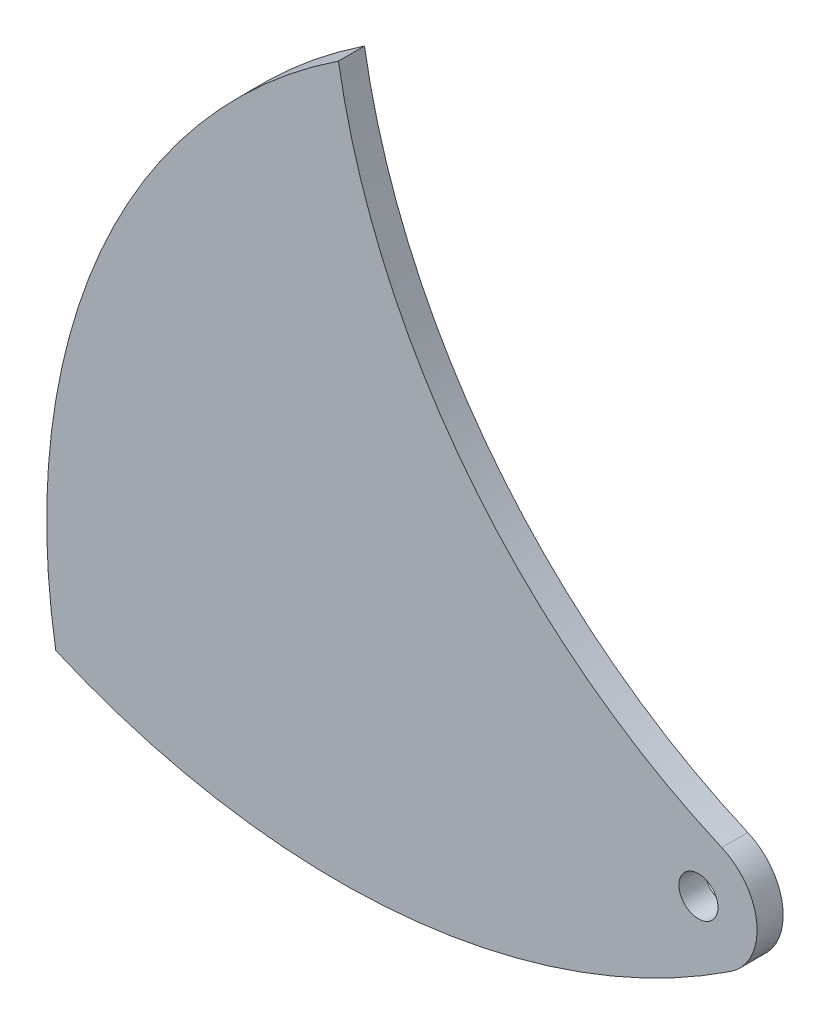
ISO-10303-21;
HEADER;
FILE_DESCRIPTION(('STEP AP214'),'2;1');
FILE_NAME('part.step','',(''),(''),'','','');
FILE_SCHEMA(('AUTOMOTIVE_DESIGN { 1 0 10303 214 1 1 1 1 }'));
ENDSEC;
DATA;
#1=APPLICATION_CONTEXT('core data for automotive mechanical design processes');
#2=APPLICATION_PROTOCOL_DEFINITION('international standard','automotive_design',2000,#1);
#3=PRODUCT_CONTEXT('',#1,'mechanical');
#4=PRODUCT('Part','Part','',(#3));
#5=PRODUCT_RELATED_PRODUCT_CATEGORY('part','',(#4));
#6=PRODUCT_DEFINITION_FORMATION('','',#4);
#7=PRODUCT_DEFINITION_CONTEXT('part definition',#1,'design');
#8=PRODUCT_DEFINITION('design','',#6,#7);
#9=PRODUCT_DEFINITION_SHAPE('','',#8);
#10=(LENGTH_UNIT() NAMED_UNIT(*) SI_UNIT(.MILLI.,.METRE.));
#11=(NAMED_UNIT(*) PLANE_ANGLE_UNIT() SI_UNIT($,.RADIAN.));
#12=(NAMED_UNIT(*) SI_UNIT($,.STERADIAN.) SOLID_ANGLE_UNIT());
#13=UNCERTAINTY_MEASURE_WITH_UNIT(LENGTH_MEASURE(1.E-05),#10,'distance_accuracy_value','');
#14=(GEOMETRIC_REPRESENTATION_CONTEXT(3) GLOBAL_UNCERTAINTY_ASSIGNED_CONTEXT((#13)) GLOBAL_UNIT_ASSIGNED_CONTEXT((#10,
#11,#12)) REPRESENTATION_CONTEXT('',''));
#15=CARTESIAN_POINT('',(0.,0.,0.));
#16=DIRECTION('',(0.,0.,1.));
#17=DIRECTION('',(1.,0.,0.));
#18=AXIS2_PLACEMENT_3D('',#15,#16,#17);
#19=CARTESIAN_POINT('',(5.42131211055036,12.5,1.));
#20=DIRECTION('',(0.,0.,1.));
#21=DIRECTION('',(1.,0.,0.));
#22=AXIS2_PLACEMENT_3D('',#19,#20,#21);
#23=PLANE('',#22);
#24=CARTESIAN_POINT('',(10.8426242211007,25.,1.));
#25=DIRECTION('',(0.,0.,-1.));
#26=DIRECTION('',(1.,0.,0.));
#27=AXIS2_PLACEMENT_3D('',#24,#25,#26);
#28=CIRCLE('',#27,25.);
#29=CARTESIAN_POINT('',(0.895262550366114,2.06422018348624,1.));
#30=VERTEX_POINT('',#29);
#31=CARTESIAN_POINT('',(-13.8088723865261,20.8402265681695,1.));
#32=VERTEX_POINT('',#31);
#33=EDGE_CURVE('E85',#30,#32,#28,.T.);
#34=ORIENTED_EDGE('',*,*,#33,.T.);
#35=CARTESIAN_POINT('',(0.,0.,1.));
#36=DIRECTION('',(0.,0.,1.));
#37=DIRECTION('',(1.,0.,0.));
#38=AXIS2_PLACEMENT_3D('',#35,#36,#37);
#39=CIRCLE('',#38,25.);
#40=CARTESIAN_POINT('',(-24.6514966076268,-4.15977343183052,1.));
#41=VERTEX_POINT('',#40);
#42=EDGE_CURVE('E80',#32,#41,#39,.T.);
#43=ORIENTED_EDGE('',*,*,#42,.T.);
#44=CARTESIAN_POINT('',(-13.8088723865261,20.8402265681695,1.));
#45=DIRECTION('',(0.,0.,1.));
#46=DIRECTION('',(1.,0.,0.));
#47=AXIS2_PLACEMENT_3D('',#44,#45,#46);
#48=CIRCLE('',#47,27.25);
#49=CARTESIAN_POINT('',(1.24279851478735,-1.87562039113525,1.));
#50=VERTEX_POINT('',#49);
#51=EDGE_CURVE('E83',#41,#50,#48,.T.);
#52=ORIENTED_EDGE('',*,*,#51,.T.);
#53=CARTESIAN_POINT('',(0.,0.,1.));
#54=DIRECTION('',(0.,0.,1.));
#55=DIRECTION('',(1.,0.,0.));
#56=AXIS2_PLACEMENT_3D('',#53,#54,#55);
#57=CIRCLE('',#56,2.25);
#58=EDGE_CURVE('E50',#50,#30,#57,.T.);
#59=ORIENTED_EDGE('',*,*,#58,.T.);
#60=EDGE_LOOP('',(#34,#43,#52,#59));
#61=FACE_BOUND('',#60,.T.);
#62=CARTESIAN_POINT('',(0.,0.,1.));
#63=DIRECTION('',(0.,0.,1.));
#64=DIRECTION('',(1.,0.,0.));
#65=AXIS2_PLACEMENT_3D('',#62,#63,#64);
#66=CIRCLE('',#65,0.75);
#67=CARTESIAN_POINT('',(0.75,0.,1.));
#68=VERTEX_POINT('',#67);
#69=EDGE_CURVE('E100',#68,#68,#66,.T.);
#70=ORIENTED_EDGE('',*,*,#69,.F.);
#71=EDGE_LOOP('',(#70));
#72=FACE_BOUND('',#71,.T.);
#73=ADVANCED_FACE('F33',(#61,#72),#23,.T.);
#74=CARTESIAN_POINT('',(5.42131211055036,12.5,0.));
#75=DIRECTION('',(0.,0.,1.));
#76=DIRECTION('',(1.,0.,0.));
#77=AXIS2_PLACEMENT_3D('',#74,#75,#76);
#78=PLANE('',#77);
#79=CARTESIAN_POINT('',(10.8426242211007,25.,0.));
#80=DIRECTION('',(0.,0.,-1.));
#81=DIRECTION('',(1.,0.,0.));
#82=AXIS2_PLACEMENT_3D('',#79,#80,#81);
#83=CIRCLE('',#82,25.);
#84=CARTESIAN_POINT('',(0.895262550366114,2.06422018348624,0.));
#85=VERTEX_POINT('',#84);
#86=CARTESIAN_POINT('',(-13.8088723865261,20.8402265681695,0.));
#87=VERTEX_POINT('',#86);
#88=EDGE_CURVE('E97',#85,#87,#83,.T.);
#89=ORIENTED_EDGE('',*,*,#88,.F.);
#90=CARTESIAN_POINT('',(0.,0.,0.));
#91=DIRECTION('',(0.,0.,1.));
#92=DIRECTION('',(1.,0.,0.));
#93=AXIS2_PLACEMENT_3D('',#90,#91,#92);
#94=CIRCLE('',#93,2.25);
#95=CARTESIAN_POINT('',(1.24279851478735,-1.87562039113525,0.));
#96=VERTEX_POINT('',#95);
#97=EDGE_CURVE('E73',#96,#85,#94,.T.);
#98=ORIENTED_EDGE('',*,*,#97,.F.);
#99=CARTESIAN_POINT('',(-13.8088723865261,20.8402265681695,0.));
#100=DIRECTION('',(0.,0.,1.));
#101=DIRECTION('',(1.,0.,0.));
#102=AXIS2_PLACEMENT_3D('',#99,#100,#101);
#103=CIRCLE('',#102,27.25);
#104=CARTESIAN_POINT('',(-24.6514966076268,-4.15977343183052,0.));
#105=VERTEX_POINT('',#104);
#106=EDGE_CURVE('E67',#105,#96,#103,.T.);
#107=ORIENTED_EDGE('',*,*,#106,.F.);
#108=CARTESIAN_POINT('',(0.,0.,0.));
#109=DIRECTION('',(0.,0.,1.));
#110=DIRECTION('',(1.,0.,0.));
#111=AXIS2_PLACEMENT_3D('',#108,#109,#110);
#112=CIRCLE('',#111,25.);
#113=EDGE_CURVE('E89',#87,#105,#112,.T.);
#114=ORIENTED_EDGE('',*,*,#113,.F.);
#115=EDGE_LOOP('',(#89,#98,#107,#114));
#116=FACE_BOUND('',#115,.T.);
#117=CARTESIAN_POINT('',(0.,0.,0.));
#118=DIRECTION('',(0.,0.,1.));
#119=DIRECTION('',(1.,0.,0.));
#120=AXIS2_PLACEMENT_3D('',#117,#118,#119);
#121=CIRCLE('',#120,0.75);
#122=CARTESIAN_POINT('',(0.75,0.,0.));
#123=VERTEX_POINT('',#122);
#124=EDGE_CURVE('E112',#123,#123,#121,.T.);
#125=ORIENTED_EDGE('',*,*,#124,.T.);
#126=EDGE_LOOP('',(#125));
#127=FACE_BOUND('',#126,.T.);
#128=ADVANCED_FACE('F108',(#116,#127),#78,.F.);
#129=CARTESIAN_POINT('',(10.8426242211007,25.,1.));
#130=DIRECTION('',(0.,0.,-1.));
#131=DIRECTION('',(-1.,0.,0.));
#132=AXIS2_PLACEMENT_3D('',#129,#130,#131);
#133=CYLINDRICAL_SURFACE('',#132,25.);
#134=ORIENTED_EDGE('',*,*,#88,.T.);
#135=DIRECTION('',(0.,0.,-1.));
#136=VECTOR('',#135,1.);
#137=CARTESIAN_POINT('',(-13.8088723865261,20.8402265681695,1.));
#138=LINE('',#137,#136);
#139=EDGE_CURVE('E11',#32,#87,#138,.T.);
#140=ORIENTED_EDGE('',*,*,#139,.F.);
#141=ORIENTED_EDGE('',*,*,#33,.F.);
#142=DIRECTION('',(0.,0.,-1.));
#143=VECTOR('',#142,1.);
#144=CARTESIAN_POINT('',(0.895262550366114,2.06422018348624,1.));
#145=LINE('',#144,#143);
#146=EDGE_CURVE('E93',#30,#85,#145,.T.);
#147=ORIENTED_EDGE('',*,*,#146,.T.);
#148=EDGE_LOOP('',(#134,#140,#141,#147));
#149=FACE_BOUND('',#148,.T.);
#150=ADVANCED_FACE('F35',(#149),#133,.F.);
#151=CARTESIAN_POINT('',(0.,0.,1.));
#152=DIRECTION('',(0.,0.,-1.));
#153=DIRECTION('',(-1.,0.,0.));
#154=AXIS2_PLACEMENT_3D('',#151,#152,#153);
#155=CYLINDRICAL_SURFACE('',#154,25.);
#156=ORIENTED_EDGE('',*,*,#113,.T.);
#157=DIRECTION('',(0.,0.,-1.));
#158=VECTOR('',#157,1.);
#159=CARTESIAN_POINT('',(-24.6514966076268,-4.15977343183052,1.));
#160=LINE('',#159,#158);
#161=EDGE_CURVE('E42',#41,#105,#160,.T.);
#162=ORIENTED_EDGE('',*,*,#161,.F.);
#163=ORIENTED_EDGE('',*,*,#42,.F.);
#164=ORIENTED_EDGE('',*,*,#139,.T.);
#165=EDGE_LOOP('',(#156,#162,#163,#164));
#166=FACE_BOUND('',#165,.T.);
#167=ADVANCED_FACE('F88',(#166),#155,.T.);
#168=CARTESIAN_POINT('',(-13.8088723865261,20.8402265681695,1.));
#169=DIRECTION('',(0.,0.,-1.));
#170=DIRECTION('',(-1.,0.,0.));
#171=AXIS2_PLACEMENT_3D('',#168,#169,#170);
#172=CYLINDRICAL_SURFACE('',#171,27.25);
#173=ORIENTED_EDGE('',*,*,#106,.T.);
#174=DIRECTION('',(0.,0.,-1.));
#175=VECTOR('',#174,1.);
#176=CARTESIAN_POINT('',(1.24279851478735,-1.87562039113525,1.));
#177=LINE('',#176,#175);
#178=EDGE_CURVE('E90',#50,#96,#177,.T.);
#179=ORIENTED_EDGE('',*,*,#178,.F.);
#180=ORIENTED_EDGE('',*,*,#51,.F.);
#181=ORIENTED_EDGE('',*,*,#161,.T.);
#182=EDGE_LOOP('',(#173,#179,#180,#181));
#183=FACE_BOUND('',#182,.T.);
#184=ADVANCED_FACE('F91',(#183),#172,.T.);
#185=CARTESIAN_POINT('',(0.,0.,1.));
#186=DIRECTION('',(0.,0.,-1.));
#187=DIRECTION('',(-1.,0.,0.));
#188=AXIS2_PLACEMENT_3D('',#185,#186,#187);
#189=CYLINDRICAL_SURFACE('',#188,2.25);
#190=ORIENTED_EDGE('',*,*,#97,.T.);
#191=ORIENTED_EDGE('',*,*,#146,.F.);
#192=ORIENTED_EDGE('',*,*,#58,.F.);
#193=ORIENTED_EDGE('',*,*,#178,.T.);
#194=EDGE_LOOP('',(#190,#191,#192,#193));
#195=FACE_BOUND('',#194,.T.);
#196=ADVANCED_FACE('F105',(#195),#189,.T.);
#197=CARTESIAN_POINT('',(0.,0.,1.));
#198=DIRECTION('',(0.,0.,-1.));
#199=DIRECTION('',(-1.,0.,0.));
#200=AXIS2_PLACEMENT_3D('',#197,#198,#199);
#201=CYLINDRICAL_SURFACE('',#200,0.75);
#202=ORIENTED_EDGE('',*,*,#69,.T.);
#203=EDGE_LOOP('',(#202));
#204=FACE_BOUND('',#203,.T.);
#205=ORIENTED_EDGE('',*,*,#124,.F.);
#206=EDGE_LOOP('',(#205));
#207=FACE_BOUND('',#206,.T.);
#208=ADVANCED_FACE('F118',(#204,#207),#201,.F.);
#209=CLOSED_SHELL('',(#73,#128,#150,#167,#184,#196,#208));
#210=MANIFOLD_SOLID_BREP('B2',#209);
#211=ADVANCED_BREP_SHAPE_REPRESENTATION('',(#18,#210),#14);
#212=SHAPE_DEFINITION_REPRESENTATION(#9,#211);
ENDSEC;
END-ISO-10303-21;
